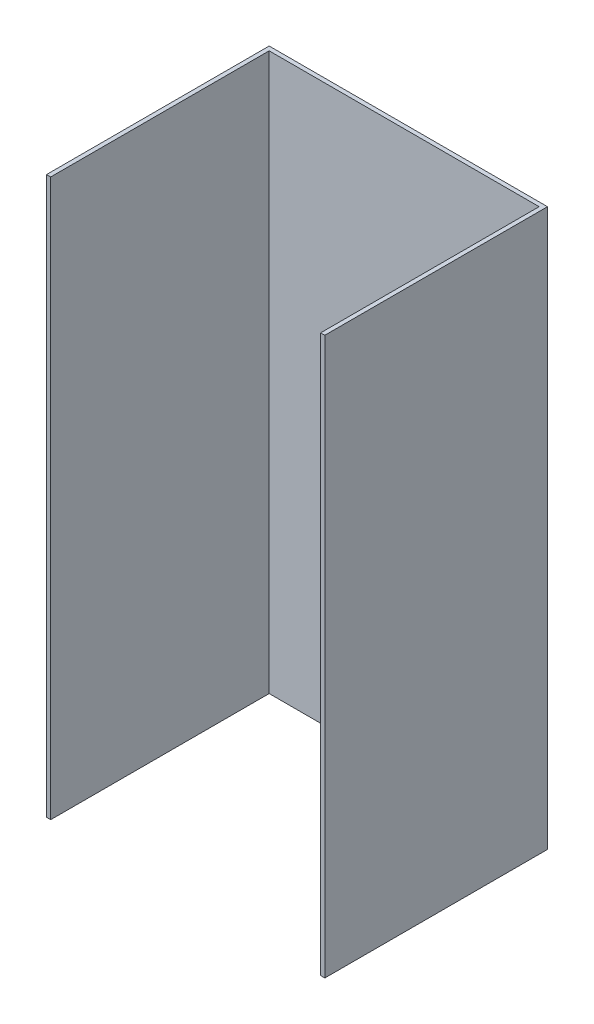
ISO-10303-21;
HEADER;
FILE_DESCRIPTION(('STEP AP214'),'2;1');
FILE_NAME('part.step','',(''),(''),'','','');
FILE_SCHEMA(('AUTOMOTIVE_DESIGN { 1 0 10303 214 1 1 1 1 }'));
ENDSEC;
DATA;
#1=APPLICATION_CONTEXT('core data for automotive mechanical design processes');
#2=APPLICATION_PROTOCOL_DEFINITION('international standard','automotive_design',2000,#1);
#3=PRODUCT_CONTEXT('',#1,'mechanical');
#4=PRODUCT('Part','Part','',(#3));
#5=PRODUCT_RELATED_PRODUCT_CATEGORY('part','',(#4));
#6=PRODUCT_DEFINITION_FORMATION('','',#4);
#7=PRODUCT_DEFINITION_CONTEXT('part definition',#1,'design');
#8=PRODUCT_DEFINITION('design','',#6,#7);
#9=PRODUCT_DEFINITION_SHAPE('','',#8);
#10=(LENGTH_UNIT() NAMED_UNIT(*) SI_UNIT(.MILLI.,.METRE.));
#11=(NAMED_UNIT(*) PLANE_ANGLE_UNIT() SI_UNIT($,.RADIAN.));
#12=(NAMED_UNIT(*) SI_UNIT($,.STERADIAN.) SOLID_ANGLE_UNIT());
#13=UNCERTAINTY_MEASURE_WITH_UNIT(LENGTH_MEASURE(1.E-05),#10,'distance_accuracy_value','');
#14=(GEOMETRIC_REPRESENTATION_CONTEXT(3) GLOBAL_UNCERTAINTY_ASSIGNED_CONTEXT((#13)) GLOBAL_UNIT_ASSIGNED_CONTEXT((#10,
#11,#12)) REPRESENTATION_CONTEXT('',''));
#15=CARTESIAN_POINT('',(0.,0.,0.));
#16=DIRECTION('',(0.,0.,1.));
#17=DIRECTION('',(1.,0.,0.));
#18=AXIS2_PLACEMENT_3D('',#15,#16,#17);
#19=CARTESIAN_POINT('',(0.,0.,80.));
#20=DIRECTION('',(0.,0.,1.));
#21=DIRECTION('',(1.,0.,0.));
#22=AXIS2_PLACEMENT_3D('',#19,#20,#21);
#23=PLANE('',#22);
#24=DIRECTION('',(0.,-1.,0.));
#25=VECTOR('',#24,1.);
#26=CARTESIAN_POINT('',(-48.5,-100.,80.));
#27=LINE('',#26,#25);
#28=CARTESIAN_POINT('',(-48.5,100.,80.));
#29=VERTEX_POINT('',#28);
#30=CARTESIAN_POINT('',(-48.5,-100.,80.));
#31=VERTEX_POINT('',#30);
#32=EDGE_CURVE('E121',#29,#31,#27,.T.);
#33=ORIENTED_EDGE('',*,*,#32,.F.);
#34=DIRECTION('',(-1.,0.,0.));
#35=VECTOR('',#34,1.);
#36=CARTESIAN_POINT('',(50.,100.,80.));
#37=LINE('',#36,#35);
#38=CARTESIAN_POINT('',(-50.,100.,80.));
#39=VERTEX_POINT('',#38);
#40=EDGE_CURVE('E64',#29,#39,#37,.T.);
#41=ORIENTED_EDGE('',*,*,#40,.T.);
#42=DIRECTION('',(0.,-1.,0.));
#43=VECTOR('',#42,1.);
#44=CARTESIAN_POINT('',(-50.,-100.,80.));
#45=LINE('',#44,#43);
#46=CARTESIAN_POINT('',(-50.,-100.,80.));
#47=VERTEX_POINT('',#46);
#48=EDGE_CURVE('E157',#39,#47,#45,.T.);
#49=ORIENTED_EDGE('',*,*,#48,.T.);
#50=DIRECTION('',(1.,0.,0.));
#51=VECTOR('',#50,1.);
#52=CARTESIAN_POINT('',(50.,-100.,80.));
#53=LINE('',#52,#51);
#54=EDGE_CURVE('E93',#47,#31,#53,.T.);
#55=ORIENTED_EDGE('',*,*,#54,.T.);
#56=EDGE_LOOP('',(#33,#41,#49,#55));
#57=FACE_BOUND('',#56,.T.);
#58=ADVANCED_FACE('F39',(#57),#23,.T.);
#59=CARTESIAN_POINT('',(-50.,-100.,80.));
#60=DIRECTION('',(1.,0.,0.));
#61=DIRECTION('',(0.,0.,-1.));
#62=AXIS2_PLACEMENT_3D('',#59,#60,#61);
#63=PLANE('',#62);
#64=DIRECTION('',(0.,-1.,0.));
#65=VECTOR('',#64,1.);
#66=CARTESIAN_POINT('',(-50.,-100.,0.));
#67=LINE('',#66,#65);
#68=CARTESIAN_POINT('',(-50.,100.,0.));
#69=VERTEX_POINT('',#68);
#70=CARTESIAN_POINT('',(-50.,-100.,0.));
#71=VERTEX_POINT('',#70);
#72=EDGE_CURVE('E124',#69,#71,#67,.T.);
#73=ORIENTED_EDGE('',*,*,#72,.T.);
#74=DIRECTION('',(0.,0.,-1.));
#75=VECTOR('',#74,1.);
#76=CARTESIAN_POINT('',(-50.,-100.,80.));
#77=LINE('',#76,#75);
#78=EDGE_CURVE('E11',#47,#71,#77,.T.);
#79=ORIENTED_EDGE('',*,*,#78,.F.);
#80=ORIENTED_EDGE('',*,*,#48,.F.);
#81=DIRECTION('',(0.,0.,-1.));
#82=VECTOR('',#81,1.);
#83=CARTESIAN_POINT('',(-50.,100.,80.));
#84=LINE('',#83,#82);
#85=EDGE_CURVE('E170',#39,#69,#84,.T.);
#86=ORIENTED_EDGE('',*,*,#85,.T.);
#87=EDGE_LOOP('',(#73,#79,#80,#86));
#88=FACE_BOUND('',#87,.T.);
#89=ADVANCED_FACE('F41',(#88),#63,.F.);
#90=CARTESIAN_POINT('',(50.,-100.,80.));
#91=DIRECTION('',(0.,1.,0.));
#92=DIRECTION('',(-1.,0.,0.));
#93=AXIS2_PLACEMENT_3D('',#90,#91,#92);
#94=PLANE('',#93);
#95=CARTESIAN_POINT('',(48.5,-100.,80.));
#96=VERTEX_POINT('',#95);
#97=CARTESIAN_POINT('',(50.,-100.,80.));
#98=VERTEX_POINT('',#97);
#99=EDGE_CURVE('E160',#96,#98,#53,.T.);
#100=ORIENTED_EDGE('',*,*,#99,.F.);
#101=DIRECTION('',(0.,0.,-1.));
#102=VECTOR('',#101,1.);
#103=CARTESIAN_POINT('',(48.5,-100.,80.));
#104=LINE('',#103,#102);
#105=CARTESIAN_POINT('',(48.5,-100.,1.5));
#106=VERTEX_POINT('',#105);
#107=EDGE_CURVE('E55',#96,#106,#104,.T.);
#108=ORIENTED_EDGE('',*,*,#107,.T.);
#109=DIRECTION('',(1.,0.,0.));
#110=VECTOR('',#109,1.);
#111=CARTESIAN_POINT('',(50.,-100.,1.5));
#112=LINE('',#111,#110);
#113=CARTESIAN_POINT('',(-48.5,-100.,1.5));
#114=VERTEX_POINT('',#113);
#115=EDGE_CURVE('E128',#114,#106,#112,.T.);
#116=ORIENTED_EDGE('',*,*,#115,.F.);
#117=DIRECTION('',(0.,0.,-1.));
#118=VECTOR('',#117,1.);
#119=CARTESIAN_POINT('',(-48.5,-100.,80.));
#120=LINE('',#119,#118);
#121=EDGE_CURVE('E116',#31,#114,#120,.T.);
#122=ORIENTED_EDGE('',*,*,#121,.F.);
#123=ORIENTED_EDGE('',*,*,#54,.F.);
#124=ORIENTED_EDGE('',*,*,#78,.T.);
#125=DIRECTION('',(1.,0.,0.));
#126=VECTOR('',#125,1.);
#127=CARTESIAN_POINT('',(50.,-100.,0.));
#128=LINE('',#127,#126);
#129=CARTESIAN_POINT('',(50.,-100.,0.));
#130=VERTEX_POINT('',#129);
#131=EDGE_CURVE('E174',#71,#130,#128,.T.);
#132=ORIENTED_EDGE('',*,*,#131,.T.);
#133=DIRECTION('',(0.,0.,-1.));
#134=VECTOR('',#133,1.);
#135=CARTESIAN_POINT('',(50.,-100.,80.));
#136=LINE('',#135,#134);
#137=EDGE_CURVE('E48',#98,#130,#136,.T.);
#138=ORIENTED_EDGE('',*,*,#137,.F.);
#139=EDGE_LOOP('',(#100,#108,#116,#122,#123,#124,#132,#138));
#140=FACE_BOUND('',#139,.T.);
#141=ADVANCED_FACE('F134',(#140),#94,.F.);
#142=CARTESIAN_POINT('',(50.,-100.,80.));
#143=DIRECTION('',(-1.,0.,0.));
#144=DIRECTION('',(0.,0.,1.));
#145=AXIS2_PLACEMENT_3D('',#142,#143,#144);
#146=PLANE('',#145);
#147=DIRECTION('',(0.,1.,0.));
#148=VECTOR('',#147,1.);
#149=CARTESIAN_POINT('',(50.,-100.,0.));
#150=LINE('',#149,#148);
#151=CARTESIAN_POINT('',(50.,100.,0.));
#152=VERTEX_POINT('',#151);
#153=EDGE_CURVE('E177',#130,#152,#150,.T.);
#154=ORIENTED_EDGE('',*,*,#153,.T.);
#155=DIRECTION('',(0.,0.,-1.));
#156=VECTOR('',#155,1.);
#157=CARTESIAN_POINT('',(50.,100.,80.));
#158=LINE('',#157,#156);
#159=CARTESIAN_POINT('',(50.,100.,80.));
#160=VERTEX_POINT('',#159);
#161=EDGE_CURVE('E184',#160,#152,#158,.T.);
#162=ORIENTED_EDGE('',*,*,#161,.F.);
#163=DIRECTION('',(0.,1.,0.));
#164=VECTOR('',#163,1.);
#165=CARTESIAN_POINT('',(50.,-100.,80.));
#166=LINE('',#165,#164);
#167=EDGE_CURVE('E163',#98,#160,#166,.T.);
#168=ORIENTED_EDGE('',*,*,#167,.F.);
#169=ORIENTED_EDGE('',*,*,#137,.T.);
#170=EDGE_LOOP('',(#154,#162,#168,#169));
#171=FACE_BOUND('',#170,.T.);
#172=ADVANCED_FACE('F192',(#171),#146,.F.);
#173=CARTESIAN_POINT('',(50.,100.,80.));
#174=DIRECTION('',(0.,-1.,0.));
#175=DIRECTION('',(1.,0.,0.));
#176=AXIS2_PLACEMENT_3D('',#173,#174,#175);
#177=PLANE('',#176);
#178=ORIENTED_EDGE('',*,*,#40,.F.);
#179=DIRECTION('',(0.,0.,-1.));
#180=VECTOR('',#179,1.);
#181=CARTESIAN_POINT('',(-48.5,100.,80.));
#182=LINE('',#181,#180);
#183=CARTESIAN_POINT('',(-48.5,100.,1.5));
#184=VERTEX_POINT('',#183);
#185=EDGE_CURVE('E147',#29,#184,#182,.T.);
#186=ORIENTED_EDGE('',*,*,#185,.T.);
#187=DIRECTION('',(-1.,0.,0.));
#188=VECTOR('',#187,1.);
#189=CARTESIAN_POINT('',(50.,100.,1.5));
#190=LINE('',#189,#188);
#191=CARTESIAN_POINT('',(48.5,100.,1.5));
#192=VERTEX_POINT('',#191);
#193=EDGE_CURVE('E130',#192,#184,#190,.T.);
#194=ORIENTED_EDGE('',*,*,#193,.F.);
#195=DIRECTION('',(0.,0.,-1.));
#196=VECTOR('',#195,1.);
#197=CARTESIAN_POINT('',(48.5,100.,80.));
#198=LINE('',#197,#196);
#199=CARTESIAN_POINT('',(48.5,100.,80.));
#200=VERTEX_POINT('',#199);
#201=EDGE_CURVE('E143',#200,#192,#198,.T.);
#202=ORIENTED_EDGE('',*,*,#201,.F.);
#203=EDGE_CURVE('E166',#160,#200,#37,.T.);
#204=ORIENTED_EDGE('',*,*,#203,.F.);
#205=ORIENTED_EDGE('',*,*,#161,.T.);
#206=DIRECTION('',(-1.,0.,0.));
#207=VECTOR('',#206,1.);
#208=CARTESIAN_POINT('',(50.,100.,0.));
#209=LINE('',#208,#207);
#210=EDGE_CURVE('E86',#152,#69,#209,.T.);
#211=ORIENTED_EDGE('',*,*,#210,.T.);
#212=ORIENTED_EDGE('',*,*,#85,.F.);
#213=EDGE_LOOP('',(#178,#186,#194,#202,#204,#205,#211,#212));
#214=FACE_BOUND('',#213,.T.);
#215=ADVANCED_FACE('F200',(#214),#177,.F.);
#216=DIRECTION('',(0.,1.,0.));
#217=VECTOR('',#216,1.);
#218=CARTESIAN_POINT('',(48.5,-100.,80.));
#219=LINE('',#218,#217);
#220=EDGE_CURVE('E144',#96,#200,#219,.T.);
#221=ORIENTED_EDGE('',*,*,#220,.F.);
#222=ORIENTED_EDGE('',*,*,#99,.T.);
#223=ORIENTED_EDGE('',*,*,#167,.T.);
#224=ORIENTED_EDGE('',*,*,#203,.T.);
#225=EDGE_LOOP('',(#221,#222,#223,#224));
#226=FACE_BOUND('',#225,.T.);
#227=ADVANCED_FACE('F204',(#226),#23,.T.);
#228=CARTESIAN_POINT('',(0.,0.,0.));
#229=DIRECTION('',(0.,0.,1.));
#230=DIRECTION('',(1.,0.,0.));
#231=AXIS2_PLACEMENT_3D('',#228,#229,#230);
#232=PLANE('',#231);
#233=ORIENTED_EDGE('',*,*,#72,.F.);
#234=ORIENTED_EDGE('',*,*,#210,.F.);
#235=ORIENTED_EDGE('',*,*,#153,.F.);
#236=ORIENTED_EDGE('',*,*,#131,.F.);
#237=EDGE_LOOP('',(#233,#234,#235,#236));
#238=FACE_BOUND('',#237,.T.);
#239=ADVANCED_FACE('F196',(#238),#232,.F.);
#240=CARTESIAN_POINT('',(-48.5,-100.,80.));
#241=DIRECTION('',(1.,0.,0.));
#242=DIRECTION('',(0.,0.,-1.));
#243=AXIS2_PLACEMENT_3D('',#240,#241,#242);
#244=PLANE('',#243);
#245=DIRECTION('',(0.,-1.,0.));
#246=VECTOR('',#245,1.);
#247=CARTESIAN_POINT('',(-48.5,-100.,1.5));
#248=LINE('',#247,#246);
#249=EDGE_CURVE('E119',#184,#114,#248,.T.);
#250=ORIENTED_EDGE('',*,*,#249,.F.);
#251=ORIENTED_EDGE('',*,*,#185,.F.);
#252=ORIENTED_EDGE('',*,*,#32,.T.);
#253=ORIENTED_EDGE('',*,*,#121,.T.);
#254=EDGE_LOOP('',(#250,#251,#252,#253));
#255=FACE_BOUND('',#254,.T.);
#256=ADVANCED_FACE('F118',(#255),#244,.T.);
#257=CARTESIAN_POINT('',(48.5,-100.,80.));
#258=DIRECTION('',(-1.,0.,0.));
#259=DIRECTION('',(0.,0.,1.));
#260=AXIS2_PLACEMENT_3D('',#257,#258,#259);
#261=PLANE('',#260);
#262=DIRECTION('',(0.,1.,0.));
#263=VECTOR('',#262,1.);
#264=CARTESIAN_POINT('',(48.5,-100.,1.5));
#265=LINE('',#264,#263);
#266=EDGE_CURVE('E136',#106,#192,#265,.T.);
#267=ORIENTED_EDGE('',*,*,#266,.F.);
#268=ORIENTED_EDGE('',*,*,#107,.F.);
#269=ORIENTED_EDGE('',*,*,#220,.T.);
#270=ORIENTED_EDGE('',*,*,#201,.T.);
#271=EDGE_LOOP('',(#267,#268,#269,#270));
#272=FACE_BOUND('',#271,.T.);
#273=ADVANCED_FACE('F207',(#272),#261,.T.);
#274=CARTESIAN_POINT('',(0.,0.,1.5));
#275=DIRECTION('',(0.,0.,1.));
#276=DIRECTION('',(1.,0.,0.));
#277=AXIS2_PLACEMENT_3D('',#274,#275,#276);
#278=PLANE('',#277);
#279=ORIENTED_EDGE('',*,*,#249,.T.);
#280=ORIENTED_EDGE('',*,*,#115,.T.);
#281=ORIENTED_EDGE('',*,*,#266,.T.);
#282=ORIENTED_EDGE('',*,*,#193,.T.);
#283=EDGE_LOOP('',(#279,#280,#281,#282));
#284=FACE_BOUND('',#283,.T.);
#285=ADVANCED_FACE('F127',(#284),#278,.T.);
#286=CLOSED_SHELL('',(#58,#89,#141,#172,#215,#227,#239,#256,#273,#285));
#287=MANIFOLD_SOLID_BREP('B2',#286);
#288=ADVANCED_BREP_SHAPE_REPRESENTATION('',(#18,#287),#14);
#289=SHAPE_DEFINITION_REPRESENTATION(#9,#288);
ENDSEC;
END-ISO-10303-21;
